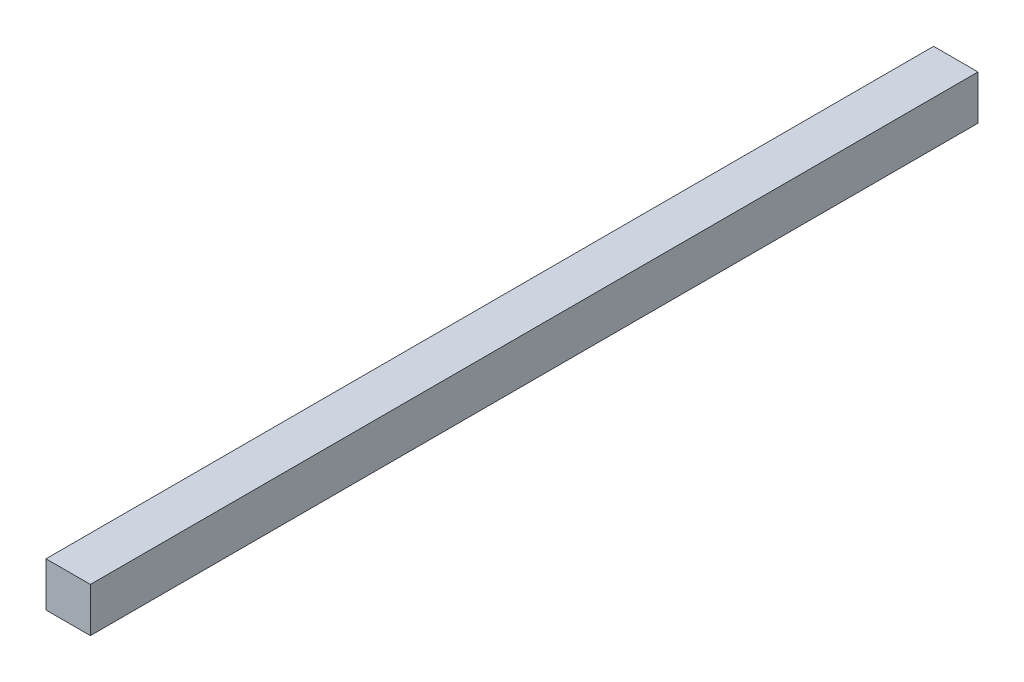
ISO-10303-21;
HEADER;
FILE_DESCRIPTION(('STEP AP214'),'2;1');
FILE_NAME('part.step','',(''),(''),'','','');
FILE_SCHEMA(('AUTOMOTIVE_DESIGN { 1 0 10303 214 1 1 1 1 }'));
ENDSEC;
DATA;
#1=APPLICATION_CONTEXT('core data for automotive mechanical design processes');
#2=APPLICATION_PROTOCOL_DEFINITION('international standard','automotive_design',2000,#1);
#3=PRODUCT_CONTEXT('',#1,'mechanical');
#4=PRODUCT('Part','Part','',(#3));
#5=PRODUCT_RELATED_PRODUCT_CATEGORY('part','',(#4));
#6=PRODUCT_DEFINITION_FORMATION('','',#4);
#7=PRODUCT_DEFINITION_CONTEXT('part definition',#1,'design');
#8=PRODUCT_DEFINITION('design','',#6,#7);
#9=PRODUCT_DEFINITION_SHAPE('','',#8);
#10=(LENGTH_UNIT() NAMED_UNIT(*) SI_UNIT(.MILLI.,.METRE.));
#11=(NAMED_UNIT(*) PLANE_ANGLE_UNIT() SI_UNIT($,.RADIAN.));
#12=(NAMED_UNIT(*) SI_UNIT($,.STERADIAN.) SOLID_ANGLE_UNIT());
#13=UNCERTAINTY_MEASURE_WITH_UNIT(LENGTH_MEASURE(1.E-05),#10,'distance_accuracy_value','');
#14=(GEOMETRIC_REPRESENTATION_CONTEXT(3) GLOBAL_UNCERTAINTY_ASSIGNED_CONTEXT((#13)) GLOBAL_UNIT_ASSIGNED_CONTEXT((#10,
#11,#12)) REPRESENTATION_CONTEXT('',''));
#15=CARTESIAN_POINT('',(0.,0.,0.));
#16=DIRECTION('',(0.,0.,1.));
#17=DIRECTION('',(1.,0.,0.));
#18=AXIS2_PLACEMENT_3D('',#15,#16,#17);
#19=CARTESIAN_POINT('',(2.5,-2.5,100.));
#20=DIRECTION('',(-1.,0.,0.));
#21=DIRECTION('',(0.,0.,1.));
#22=AXIS2_PLACEMENT_3D('',#19,#20,#21);
#23=PLANE('',#22);
#24=DIRECTION('',(0.,1.,0.));
#25=VECTOR('',#24,1.);
#26=CARTESIAN_POINT('',(2.5,-2.5,0.));
#27=LINE('',#26,#25);
#28=CARTESIAN_POINT('',(2.5,-2.5,0.));
#29=VERTEX_POINT('',#28);
#30=CARTESIAN_POINT('',(2.5,2.5,0.));
#31=VERTEX_POINT('',#30);
#32=EDGE_CURVE('E102',#29,#31,#27,.T.);
#33=ORIENTED_EDGE('',*,*,#32,.T.);
#34=DIRECTION('',(0.,0.,-1.));
#35=VECTOR('',#34,1.);
#36=CARTESIAN_POINT('',(2.5,2.5,100.));
#37=LINE('',#36,#35);
#38=CARTESIAN_POINT('',(2.5,2.5,100.));
#39=VERTEX_POINT('',#38);
#40=EDGE_CURVE('E11',#39,#31,#37,.T.);
#41=ORIENTED_EDGE('',*,*,#40,.F.);
#42=DIRECTION('',(0.,1.,0.));
#43=VECTOR('',#42,1.);
#44=CARTESIAN_POINT('',(2.5,-2.5,100.));
#45=LINE('',#44,#43);
#46=CARTESIAN_POINT('',(2.5,-2.5,100.));
#47=VERTEX_POINT('',#46);
#48=EDGE_CURVE('E90',#47,#39,#45,.T.);
#49=ORIENTED_EDGE('',*,*,#48,.F.);
#50=DIRECTION('',(0.,0.,-1.));
#51=VECTOR('',#50,1.);
#52=CARTESIAN_POINT('',(2.5,-2.5,100.));
#53=LINE('',#52,#51);
#54=EDGE_CURVE('E98',#47,#29,#53,.T.);
#55=ORIENTED_EDGE('',*,*,#54,.T.);
#56=EDGE_LOOP('',(#33,#41,#49,#55));
#57=FACE_BOUND('',#56,.T.);
#58=ADVANCED_FACE('F39',(#57),#23,.F.);
#59=CARTESIAN_POINT('',(-2.5,2.5,100.));
#60=DIRECTION('',(0.,-1.,0.));
#61=DIRECTION('',(0.,0.,-1.));
#62=AXIS2_PLACEMENT_3D('',#59,#60,#61);
#63=PLANE('',#62);
#64=DIRECTION('',(-1.,0.,0.));
#65=VECTOR('',#64,1.);
#66=CARTESIAN_POINT('',(-2.5,2.5,0.));
#67=LINE('',#66,#65);
#68=CARTESIAN_POINT('',(-2.5,2.5,0.));
#69=VERTEX_POINT('',#68);
#70=EDGE_CURVE('E94',#31,#69,#67,.T.);
#71=ORIENTED_EDGE('',*,*,#70,.T.);
#72=DIRECTION('',(0.,0.,-1.));
#73=VECTOR('',#72,1.);
#74=CARTESIAN_POINT('',(-2.5,2.5,100.));
#75=LINE('',#74,#73);
#76=CARTESIAN_POINT('',(-2.5,2.5,100.));
#77=VERTEX_POINT('',#76);
#78=EDGE_CURVE('E47',#77,#69,#75,.T.);
#79=ORIENTED_EDGE('',*,*,#78,.F.);
#80=DIRECTION('',(-1.,0.,0.));
#81=VECTOR('',#80,1.);
#82=CARTESIAN_POINT('',(-2.5,2.5,100.));
#83=LINE('',#82,#81);
#84=EDGE_CURVE('E85',#39,#77,#83,.T.);
#85=ORIENTED_EDGE('',*,*,#84,.F.);
#86=ORIENTED_EDGE('',*,*,#40,.T.);
#87=EDGE_LOOP('',(#71,#79,#85,#86));
#88=FACE_BOUND('',#87,.T.);
#89=ADVANCED_FACE('F93',(#88),#63,.F.);
#90=CARTESIAN_POINT('',(-2.5,-2.5,100.));
#91=DIRECTION('',(1.,0.,0.));
#92=DIRECTION('',(0.,0.,-1.));
#93=AXIS2_PLACEMENT_3D('',#90,#91,#92);
#94=PLANE('',#93);
#95=DIRECTION('',(0.,-1.,0.));
#96=VECTOR('',#95,1.);
#97=CARTESIAN_POINT('',(-2.5,-2.5,0.));
#98=LINE('',#97,#96);
#99=CARTESIAN_POINT('',(-2.5,-2.5,0.));
#100=VERTEX_POINT('',#99);
#101=EDGE_CURVE('E72',#69,#100,#98,.T.);
#102=ORIENTED_EDGE('',*,*,#101,.T.);
#103=DIRECTION('',(0.,0.,-1.));
#104=VECTOR('',#103,1.);
#105=CARTESIAN_POINT('',(-2.5,-2.5,100.));
#106=LINE('',#105,#104);
#107=CARTESIAN_POINT('',(-2.5,-2.5,100.));
#108=VERTEX_POINT('',#107);
#109=EDGE_CURVE('E95',#108,#100,#106,.T.);
#110=ORIENTED_EDGE('',*,*,#109,.F.);
#111=DIRECTION('',(0.,-1.,0.));
#112=VECTOR('',#111,1.);
#113=CARTESIAN_POINT('',(-2.5,-2.5,100.));
#114=LINE('',#113,#112);
#115=EDGE_CURVE('E88',#77,#108,#114,.T.);
#116=ORIENTED_EDGE('',*,*,#115,.F.);
#117=ORIENTED_EDGE('',*,*,#78,.T.);
#118=EDGE_LOOP('',(#102,#110,#116,#117));
#119=FACE_BOUND('',#118,.T.);
#120=ADVANCED_FACE('F96',(#119),#94,.F.);
#121=CARTESIAN_POINT('',(-2.5,-2.5,100.));
#122=DIRECTION('',(0.,1.,0.));
#123=DIRECTION('',(0.,0.,1.));
#124=AXIS2_PLACEMENT_3D('',#121,#122,#123);
#125=PLANE('',#124);
#126=DIRECTION('',(1.,0.,0.));
#127=VECTOR('',#126,1.);
#128=CARTESIAN_POINT('',(-2.5,-2.5,0.));
#129=LINE('',#128,#127);
#130=EDGE_CURVE('E78',#100,#29,#129,.T.);
#131=ORIENTED_EDGE('',*,*,#130,.T.);
#132=ORIENTED_EDGE('',*,*,#54,.F.);
#133=DIRECTION('',(1.,0.,0.));
#134=VECTOR('',#133,1.);
#135=CARTESIAN_POINT('',(-2.5,-2.5,100.));
#136=LINE('',#135,#134);
#137=EDGE_CURVE('E55',#108,#47,#136,.T.);
#138=ORIENTED_EDGE('',*,*,#137,.F.);
#139=ORIENTED_EDGE('',*,*,#109,.T.);
#140=EDGE_LOOP('',(#131,#132,#138,#139));
#141=FACE_BOUND('',#140,.T.);
#142=ADVANCED_FACE('F109',(#141),#125,.F.);
#143=CARTESIAN_POINT('',(0.,0.,100.));
#144=DIRECTION('',(0.,0.,-1.));
#145=DIRECTION('',(-1.,0.,0.));
#146=AXIS2_PLACEMENT_3D('',#143,#144,#145);
#147=PLANE('',#146);
#148=ORIENTED_EDGE('',*,*,#48,.T.);
#149=ORIENTED_EDGE('',*,*,#84,.T.);
#150=ORIENTED_EDGE('',*,*,#115,.T.);
#151=ORIENTED_EDGE('',*,*,#137,.T.);
#152=EDGE_LOOP('',(#148,#149,#150,#151));
#153=FACE_BOUND('',#152,.T.);
#154=ADVANCED_FACE('F86',(#153),#147,.F.);
#155=CARTESIAN_POINT('',(0.,0.,0.));
#156=DIRECTION('',(0.,0.,-1.));
#157=DIRECTION('',(-1.,0.,0.));
#158=AXIS2_PLACEMENT_3D('',#155,#156,#157);
#159=PLANE('',#158);
#160=ORIENTED_EDGE('',*,*,#32,.F.);
#161=ORIENTED_EDGE('',*,*,#130,.F.);
#162=ORIENTED_EDGE('',*,*,#101,.F.);
#163=ORIENTED_EDGE('',*,*,#70,.F.);
#164=EDGE_LOOP('',(#160,#161,#162,#163));
#165=FACE_BOUND('',#164,.T.);
#166=ADVANCED_FACE('F112',(#165),#159,.T.);
#167=CLOSED_SHELL('',(#58,#89,#120,#142,#154,#166));
#168=MANIFOLD_SOLID_BREP('B2',#167);
#169=ADVANCED_BREP_SHAPE_REPRESENTATION('',(#18,#168),#14);
#170=SHAPE_DEFINITION_REPRESENTATION(#9,#169);
ENDSEC;
END-ISO-10303-21;
